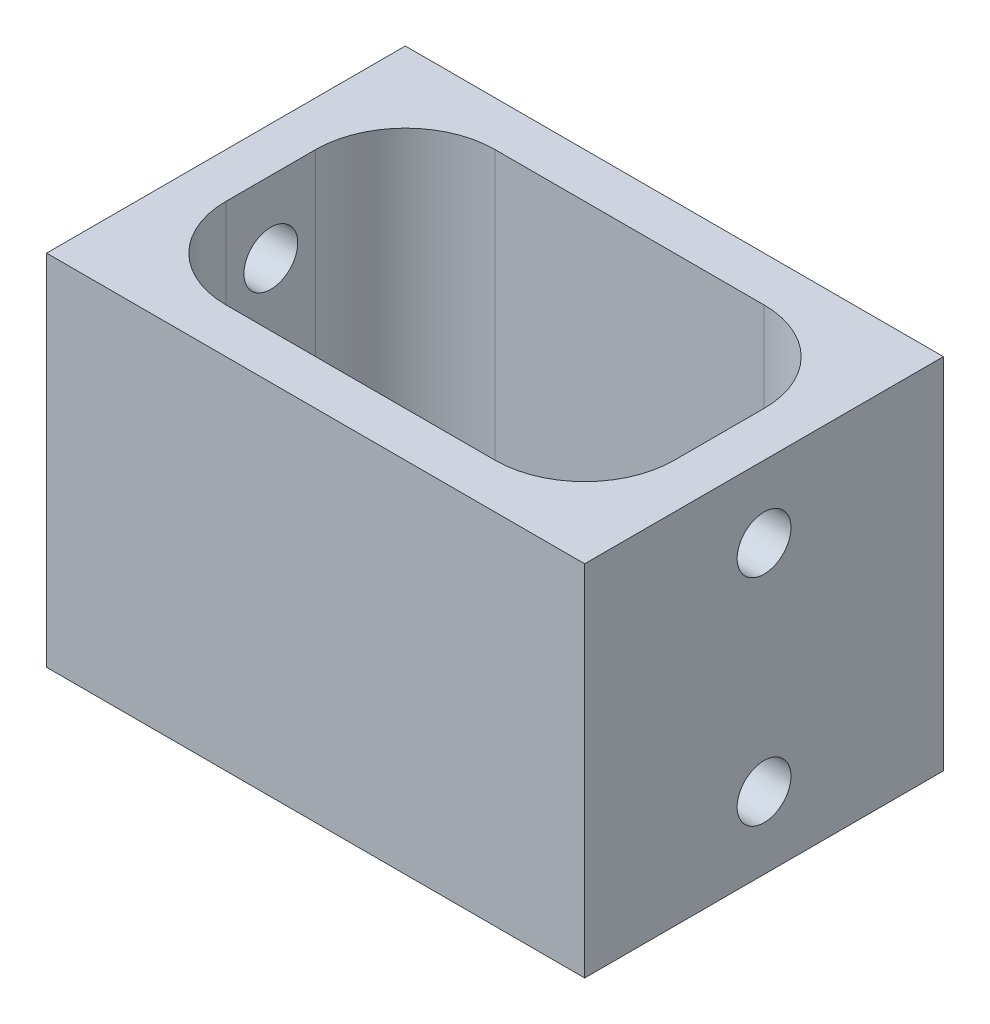
ISO-10303-21;
HEADER;
FILE_DESCRIPTION(('STEP AP214'),'2;1');
FILE_NAME('part.step','',(''),(''),'','','');
FILE_SCHEMA(('AUTOMOTIVE_DESIGN { 1 0 10303 214 1 1 1 1 }'));
ENDSEC;
DATA;
#1=APPLICATION_CONTEXT('core data for automotive mechanical design processes');
#2=APPLICATION_PROTOCOL_DEFINITION('international standard','automotive_design',2000,#1);
#3=PRODUCT_CONTEXT('',#1,'mechanical');
#4=PRODUCT('Part','Part','',(#3));
#5=PRODUCT_RELATED_PRODUCT_CATEGORY('part','',(#4));
#6=PRODUCT_DEFINITION_FORMATION('','',#4);
#7=PRODUCT_DEFINITION_CONTEXT('part definition',#1,'design');
#8=PRODUCT_DEFINITION('design','',#6,#7);
#9=PRODUCT_DEFINITION_SHAPE('','',#8);
#10=(LENGTH_UNIT() NAMED_UNIT(*) SI_UNIT(.MILLI.,.METRE.));
#11=(NAMED_UNIT(*) PLANE_ANGLE_UNIT() SI_UNIT($,.RADIAN.));
#12=(NAMED_UNIT(*) SI_UNIT($,.STERADIAN.) SOLID_ANGLE_UNIT());
#13=UNCERTAINTY_MEASURE_WITH_UNIT(LENGTH_MEASURE(1.E-05),#10,'distance_accuracy_value','');
#14=(GEOMETRIC_REPRESENTATION_CONTEXT(3) GLOBAL_UNCERTAINTY_ASSIGNED_CONTEXT((#13)) GLOBAL_UNIT_ASSIGNED_CONTEXT((#10,
#11,#12)) REPRESENTATION_CONTEXT('',''));
#15=CARTESIAN_POINT('',(0.,0.,0.));
#16=DIRECTION('',(0.,0.,1.));
#17=DIRECTION('',(1.,0.,0.));
#18=AXIS2_PLACEMENT_3D('',#15,#16,#17);
#19=CARTESIAN_POINT('',(0.,20.,0.));
#20=DIRECTION('',(0.,1.,0.));
#21=DIRECTION('',(0.,0.,1.));
#22=AXIS2_PLACEMENT_3D('',#19,#20,#21);
#23=PLANE('',#22);
#24=DIRECTION('',(0.,0.,-1.));
#25=VECTOR('',#24,1.);
#26=CARTESIAN_POINT('',(15.,20.,-10.));
#27=LINE('',#26,#25);
#28=CARTESIAN_POINT('',(15.,20.,10.));
#29=VERTEX_POINT('',#28);
#30=CARTESIAN_POINT('',(15.,20.,-10.));
#31=VERTEX_POINT('',#30);
#32=EDGE_CURVE('E136',#29,#31,#27,.T.);
#33=ORIENTED_EDGE('',*,*,#32,.T.);
#34=DIRECTION('',(-1.,0.,0.));
#35=VECTOR('',#34,1.);
#36=CARTESIAN_POINT('',(-15.,20.,-10.));
#37=LINE('',#36,#35);
#38=CARTESIAN_POINT('',(-15.,20.,-10.));
#39=VERTEX_POINT('',#38);
#40=EDGE_CURVE('E125',#31,#39,#37,.T.);
#41=ORIENTED_EDGE('',*,*,#40,.T.);
#42=DIRECTION('',(0.,0.,1.));
#43=VECTOR('',#42,1.);
#44=CARTESIAN_POINT('',(-15.,20.,-10.));
#45=LINE('',#44,#43);
#46=CARTESIAN_POINT('',(-15.,20.,10.));
#47=VERTEX_POINT('',#46);
#48=EDGE_CURVE('E135',#39,#47,#45,.T.);
#49=ORIENTED_EDGE('',*,*,#48,.T.);
#50=DIRECTION('',(1.,0.,0.));
#51=VECTOR('',#50,1.);
#52=CARTESIAN_POINT('',(-15.,20.,10.));
#53=LINE('',#52,#51);
#54=EDGE_CURVE('E140',#47,#29,#53,.T.);
#55=ORIENTED_EDGE('',*,*,#54,.T.);
#56=EDGE_LOOP('',(#33,#41,#49,#55));
#57=FACE_BOUND('',#56,.T.);
#58=DIRECTION('',(-1.,0.,0.));
#59=VECTOR('',#58,1.);
#60=CARTESIAN_POINT('',(-12.5,20.,-7.5));
#61=LINE('',#60,#59);
#62=CARTESIAN_POINT('',(7.5,20.,-7.5));
#63=VERTEX_POINT('',#62);
#64=CARTESIAN_POINT('',(-7.5,20.,-7.5));
#65=VERTEX_POINT('',#64);
#66=EDGE_CURVE('E209',#63,#65,#61,.T.);
#67=ORIENTED_EDGE('',*,*,#66,.F.);
#68=CARTESIAN_POINT('',(7.5,20.,-2.5));
#69=DIRECTION('',(0.,1.,0.));
#70=DIRECTION('',(0.,0.,1.));
#71=AXIS2_PLACEMENT_3D('',#68,#69,#70);
#72=CIRCLE('',#71,5.);
#73=CARTESIAN_POINT('',(12.5,20.,-2.5));
#74=VERTEX_POINT('',#73);
#75=EDGE_CURVE('E188',#63,#74,#72,.F.);
#76=ORIENTED_EDGE('',*,*,#75,.T.);
#77=DIRECTION('',(0.,0.,-1.));
#78=VECTOR('',#77,1.);
#79=CARTESIAN_POINT('',(12.5,20.,-7.5));
#80=LINE('',#79,#78);
#81=CARTESIAN_POINT('',(12.5,20.,2.5));
#82=VERTEX_POINT('',#81);
#83=EDGE_CURVE('E215',#82,#74,#80,.T.);
#84=ORIENTED_EDGE('',*,*,#83,.F.);
#85=CARTESIAN_POINT('',(7.5,20.,2.5));
#86=DIRECTION('',(0.,1.,0.));
#87=DIRECTION('',(0.,0.,1.));
#88=AXIS2_PLACEMENT_3D('',#85,#86,#87);
#89=CIRCLE('',#88,5.);
#90=CARTESIAN_POINT('',(7.5,20.,7.5));
#91=VERTEX_POINT('',#90);
#92=EDGE_CURVE('E184',#82,#91,#89,.F.);
#93=ORIENTED_EDGE('',*,*,#92,.T.);
#94=DIRECTION('',(1.,0.,0.));
#95=VECTOR('',#94,1.);
#96=CARTESIAN_POINT('',(-12.5,20.,7.5));
#97=LINE('',#96,#95);
#98=CARTESIAN_POINT('',(-7.5,20.,7.5));
#99=VERTEX_POINT('',#98);
#100=EDGE_CURVE('E217',#99,#91,#97,.T.);
#101=ORIENTED_EDGE('',*,*,#100,.F.);
#102=CARTESIAN_POINT('',(-7.5,20.,2.5));
#103=DIRECTION('',(0.,1.,0.));
#104=DIRECTION('',(0.,0.,1.));
#105=AXIS2_PLACEMENT_3D('',#102,#103,#104);
#106=CIRCLE('',#105,5.);
#107=CARTESIAN_POINT('',(-12.5,20.,2.5));
#108=VERTEX_POINT('',#107);
#109=EDGE_CURVE('E50',#99,#108,#106,.F.);
#110=ORIENTED_EDGE('',*,*,#109,.T.);
#111=DIRECTION('',(0.,0.,1.));
#112=VECTOR('',#111,1.);
#113=CARTESIAN_POINT('',(-12.5,20.,-7.5));
#114=LINE('',#113,#112);
#115=CARTESIAN_POINT('',(-12.5,20.,-2.5));
#116=VERTEX_POINT('',#115);
#117=EDGE_CURVE('E211',#116,#108,#114,.T.);
#118=ORIENTED_EDGE('',*,*,#117,.F.);
#119=CARTESIAN_POINT('',(-7.5,20.,-2.5));
#120=DIRECTION('',(0.,1.,0.));
#121=DIRECTION('',(0.,0.,1.));
#122=AXIS2_PLACEMENT_3D('',#119,#120,#121);
#123=CIRCLE('',#122,5.);
#124=EDGE_CURVE('E11',#116,#65,#123,.F.);
#125=ORIENTED_EDGE('',*,*,#124,.T.);
#126=EDGE_LOOP('',(#67,#76,#84,#93,#101,#110,#118,#125));
#127=FACE_BOUND('',#126,.T.);
#128=ADVANCED_FACE('F35',(#57,#127),#23,.T.);
#129=CARTESIAN_POINT('',(0.,0.,0.));
#130=DIRECTION('',(0.,1.,0.));
#131=DIRECTION('',(0.,0.,1.));
#132=AXIS2_PLACEMENT_3D('',#129,#130,#131);
#133=PLANE('',#132);
#134=DIRECTION('',(0.,0.,-1.));
#135=VECTOR('',#134,1.);
#136=CARTESIAN_POINT('',(15.,0.,-10.));
#137=LINE('',#136,#135);
#138=CARTESIAN_POINT('',(15.,0.,10.));
#139=VERTEX_POINT('',#138);
#140=CARTESIAN_POINT('',(15.,0.,-10.));
#141=VERTEX_POINT('',#140);
#142=EDGE_CURVE('E148',#139,#141,#137,.T.);
#143=ORIENTED_EDGE('',*,*,#142,.F.);
#144=DIRECTION('',(1.,0.,0.));
#145=VECTOR('',#144,1.);
#146=CARTESIAN_POINT('',(-15.,0.,10.));
#147=LINE('',#146,#145);
#148=CARTESIAN_POINT('',(-15.,0.,10.));
#149=VERTEX_POINT('',#148);
#150=EDGE_CURVE('E144',#149,#139,#147,.T.);
#151=ORIENTED_EDGE('',*,*,#150,.F.);
#152=DIRECTION('',(0.,0.,1.));
#153=VECTOR('',#152,1.);
#154=CARTESIAN_POINT('',(-15.,0.,-10.));
#155=LINE('',#154,#153);
#156=CARTESIAN_POINT('',(-15.,0.,-10.));
#157=VERTEX_POINT('',#156);
#158=EDGE_CURVE('E236',#157,#149,#155,.T.);
#159=ORIENTED_EDGE('',*,*,#158,.F.);
#160=DIRECTION('',(-1.,0.,0.));
#161=VECTOR('',#160,1.);
#162=CARTESIAN_POINT('',(-15.,0.,-10.));
#163=LINE('',#162,#161);
#164=EDGE_CURVE('E234',#141,#157,#163,.T.);
#165=ORIENTED_EDGE('',*,*,#164,.F.);
#166=EDGE_LOOP('',(#143,#151,#159,#165));
#167=FACE_BOUND('',#166,.T.);
#168=DIRECTION('',(1.,0.,0.));
#169=VECTOR('',#168,1.);
#170=CARTESIAN_POINT('',(-12.5,0.,7.5));
#171=LINE('',#170,#169);
#172=CARTESIAN_POINT('',(-7.5,0.,7.5));
#173=VERTEX_POINT('',#172);
#174=CARTESIAN_POINT('',(7.5,0.,7.5));
#175=VERTEX_POINT('',#174);
#176=EDGE_CURVE('E204',#173,#175,#171,.T.);
#177=ORIENTED_EDGE('',*,*,#176,.T.);
#178=CARTESIAN_POINT('',(7.5,0.,2.5));
#179=DIRECTION('',(0.,1.,0.));
#180=DIRECTION('',(0.,0.,1.));
#181=AXIS2_PLACEMENT_3D('',#178,#179,#180);
#182=CIRCLE('',#181,5.);
#183=CARTESIAN_POINT('',(12.5,0.,2.5));
#184=VERTEX_POINT('',#183);
#185=EDGE_CURVE('E182',#175,#184,#182,.T.);
#186=ORIENTED_EDGE('',*,*,#185,.T.);
#187=DIRECTION('',(0.,0.,-1.));
#188=VECTOR('',#187,1.);
#189=CARTESIAN_POINT('',(12.5,0.,-7.5));
#190=LINE('',#189,#188);
#191=CARTESIAN_POINT('',(12.5,0.,-2.5));
#192=VERTEX_POINT('',#191);
#193=EDGE_CURVE('E225',#184,#192,#190,.T.);
#194=ORIENTED_EDGE('',*,*,#193,.T.);
#195=CARTESIAN_POINT('',(7.5,0.,-2.5));
#196=DIRECTION('',(0.,1.,0.));
#197=DIRECTION('',(0.,0.,1.));
#198=AXIS2_PLACEMENT_3D('',#195,#196,#197);
#199=CIRCLE('',#198,5.);
#200=CARTESIAN_POINT('',(7.5,0.,-7.5));
#201=VERTEX_POINT('',#200);
#202=EDGE_CURVE('E186',#192,#201,#199,.T.);
#203=ORIENTED_EDGE('',*,*,#202,.T.);
#204=DIRECTION('',(-1.,0.,0.));
#205=VECTOR('',#204,1.);
#206=CARTESIAN_POINT('',(-12.5,0.,-7.5));
#207=LINE('',#206,#205);
#208=CARTESIAN_POINT('',(-7.5,0.,-7.5));
#209=VERTEX_POINT('',#208);
#210=EDGE_CURVE('E199',#201,#209,#207,.T.);
#211=ORIENTED_EDGE('',*,*,#210,.T.);
#212=CARTESIAN_POINT('',(-7.5,0.,-2.5));
#213=DIRECTION('',(0.,1.,0.));
#214=DIRECTION('',(0.,0.,1.));
#215=AXIS2_PLACEMENT_3D('',#212,#213,#214);
#216=CIRCLE('',#215,5.);
#217=CARTESIAN_POINT('',(-12.5,0.,-2.5));
#218=VERTEX_POINT('',#217);
#219=EDGE_CURVE('E43',#209,#218,#216,.T.);
#220=ORIENTED_EDGE('',*,*,#219,.T.);
#221=DIRECTION('',(0.,0.,1.));
#222=VECTOR('',#221,1.);
#223=CARTESIAN_POINT('',(-12.5,0.,-7.5));
#224=LINE('',#223,#222);
#225=CARTESIAN_POINT('',(-12.5,0.,2.5));
#226=VERTEX_POINT('',#225);
#227=EDGE_CURVE('E197',#218,#226,#224,.T.);
#228=ORIENTED_EDGE('',*,*,#227,.T.);
#229=CARTESIAN_POINT('',(-7.5,0.,2.5));
#230=DIRECTION('',(0.,1.,0.));
#231=DIRECTION('',(0.,0.,1.));
#232=AXIS2_PLACEMENT_3D('',#229,#230,#231);
#233=CIRCLE('',#232,5.);
#234=EDGE_CURVE('E190',#226,#173,#233,.T.);
#235=ORIENTED_EDGE('',*,*,#234,.T.);
#236=EDGE_LOOP('',(#177,#186,#194,#203,#211,#220,#228,#235));
#237=FACE_BOUND('',#236,.T.);
#238=ADVANCED_FACE('F196',(#167,#237),#133,.F.);
#239=CARTESIAN_POINT('',(15.,20.,-10.));
#240=DIRECTION('',(-1.,0.,0.));
#241=DIRECTION('',(0.,0.,1.));
#242=AXIS2_PLACEMENT_3D('',#239,#240,#241);
#243=PLANE('',#242);
#244=CARTESIAN_POINT('',(15.,16.,0.));
#245=DIRECTION('',(1.,0.,0.));
#246=DIRECTION('',(0.,0.,-1.));
#247=AXIS2_PLACEMENT_3D('',#244,#245,#246);
#248=CIRCLE('',#247,1.5);
#249=CARTESIAN_POINT('',(15.,16.,-1.5));
#250=VERTEX_POINT('',#249);
#251=EDGE_CURVE('E307',#250,#250,#248,.T.);
#252=ORIENTED_EDGE('',*,*,#251,.F.);
#253=EDGE_LOOP('',(#252));
#254=FACE_BOUND('',#253,.T.);
#255=CARTESIAN_POINT('',(15.,4.,0.));
#256=DIRECTION('',(1.,0.,0.));
#257=DIRECTION('',(0.,0.,-1.));
#258=AXIS2_PLACEMENT_3D('',#255,#256,#257);
#259=CIRCLE('',#258,1.5);
#260=CARTESIAN_POINT('',(15.,4.,-1.5));
#261=VERTEX_POINT('',#260);
#262=EDGE_CURVE('E313',#261,#261,#259,.T.);
#263=ORIENTED_EDGE('',*,*,#262,.F.);
#264=EDGE_LOOP('',(#263));
#265=FACE_BOUND('',#264,.T.);
#266=ORIENTED_EDGE('',*,*,#142,.T.);
#267=DIRECTION('',(0.,-1.,0.));
#268=VECTOR('',#267,1.);
#269=CARTESIAN_POINT('',(15.,20.,-10.));
#270=LINE('',#269,#268);
#271=EDGE_CURVE('E129',#31,#141,#270,.T.);
#272=ORIENTED_EDGE('',*,*,#271,.F.);
#273=ORIENTED_EDGE('',*,*,#32,.F.);
#274=DIRECTION('',(0.,-1.,0.));
#275=VECTOR('',#274,1.);
#276=CARTESIAN_POINT('',(15.,20.,10.));
#277=LINE('',#276,#275);
#278=EDGE_CURVE('E232',#29,#139,#277,.T.);
#279=ORIENTED_EDGE('',*,*,#278,.T.);
#280=EDGE_LOOP('',(#266,#272,#273,#279));
#281=FACE_BOUND('',#280,.T.);
#282=ADVANCED_FACE('F146',(#254,#265,#281),#243,.F.);
#283=CARTESIAN_POINT('',(-15.,20.,-10.));
#284=DIRECTION('',(0.,0.,1.));
#285=DIRECTION('',(1.,0.,0.));
#286=AXIS2_PLACEMENT_3D('',#283,#284,#285);
#287=PLANE('',#286);
#288=ORIENTED_EDGE('',*,*,#164,.T.);
#289=DIRECTION('',(0.,-1.,0.));
#290=VECTOR('',#289,1.);
#291=CARTESIAN_POINT('',(-15.,20.,-10.));
#292=LINE('',#291,#290);
#293=EDGE_CURVE('E132',#39,#157,#292,.T.);
#294=ORIENTED_EDGE('',*,*,#293,.F.);
#295=ORIENTED_EDGE('',*,*,#40,.F.);
#296=ORIENTED_EDGE('',*,*,#271,.T.);
#297=EDGE_LOOP('',(#288,#294,#295,#296));
#298=FACE_BOUND('',#297,.T.);
#299=ADVANCED_FACE('F127',(#298),#287,.F.);
#300=CARTESIAN_POINT('',(-15.,20.,-10.));
#301=DIRECTION('',(1.,0.,0.));
#302=DIRECTION('',(0.,0.,-1.));
#303=AXIS2_PLACEMENT_3D('',#300,#301,#302);
#304=PLANE('',#303);
#305=CARTESIAN_POINT('',(-15.,16.,0.));
#306=DIRECTION('',(1.,0.,0.));
#307=DIRECTION('',(0.,0.,-1.));
#308=AXIS2_PLACEMENT_3D('',#305,#306,#307);
#309=CIRCLE('',#308,1.5);
#310=CARTESIAN_POINT('',(-15.,16.,-1.5));
#311=VERTEX_POINT('',#310);
#312=EDGE_CURVE('E161',#311,#311,#309,.T.);
#313=ORIENTED_EDGE('',*,*,#312,.T.);
#314=EDGE_LOOP('',(#313));
#315=FACE_BOUND('',#314,.T.);
#316=CARTESIAN_POINT('',(-15.,4.,0.));
#317=DIRECTION('',(1.,0.,0.));
#318=DIRECTION('',(0.,0.,-1.));
#319=AXIS2_PLACEMENT_3D('',#316,#317,#318);
#320=CIRCLE('',#319,1.5);
#321=CARTESIAN_POINT('',(-15.,4.,-1.5));
#322=VERTEX_POINT('',#321);
#323=EDGE_CURVE('E309',#322,#322,#320,.T.);
#324=ORIENTED_EDGE('',*,*,#323,.T.);
#325=EDGE_LOOP('',(#324));
#326=FACE_BOUND('',#325,.T.);
#327=ORIENTED_EDGE('',*,*,#158,.T.);
#328=DIRECTION('',(0.,-1.,0.));
#329=VECTOR('',#328,1.);
#330=CARTESIAN_POINT('',(-15.,20.,10.));
#331=LINE('',#330,#329);
#332=EDGE_CURVE('E153',#47,#149,#331,.T.);
#333=ORIENTED_EDGE('',*,*,#332,.F.);
#334=ORIENTED_EDGE('',*,*,#48,.F.);
#335=ORIENTED_EDGE('',*,*,#293,.T.);
#336=EDGE_LOOP('',(#327,#333,#334,#335));
#337=FACE_BOUND('',#336,.T.);
#338=ADVANCED_FACE('F247',(#315,#326,#337),#304,.F.);
#339=CARTESIAN_POINT('',(-15.,20.,10.));
#340=DIRECTION('',(0.,0.,-1.));
#341=DIRECTION('',(-1.,0.,0.));
#342=AXIS2_PLACEMENT_3D('',#339,#340,#341);
#343=PLANE('',#342);
#344=ORIENTED_EDGE('',*,*,#150,.T.);
#345=ORIENTED_EDGE('',*,*,#278,.F.);
#346=ORIENTED_EDGE('',*,*,#54,.F.);
#347=ORIENTED_EDGE('',*,*,#332,.T.);
#348=EDGE_LOOP('',(#344,#345,#346,#347));
#349=FACE_BOUND('',#348,.T.);
#350=ADVANCED_FACE('F243',(#349),#343,.F.);
#351=CARTESIAN_POINT('',(12.5,20.,-7.5));
#352=DIRECTION('',(-1.,0.,0.));
#353=DIRECTION('',(0.,0.,1.));
#354=AXIS2_PLACEMENT_3D('',#351,#352,#353);
#355=PLANE('',#354);
#356=CARTESIAN_POINT('',(12.5,16.,0.));
#357=DIRECTION('',(-1.,0.,0.));
#358=DIRECTION('',(0.,0.,1.));
#359=AXIS2_PLACEMENT_3D('',#356,#357,#358);
#360=CIRCLE('',#359,1.5);
#361=CARTESIAN_POINT('',(12.5,16.,1.5));
#362=VERTEX_POINT('',#361);
#363=EDGE_CURVE('E164',#362,#362,#360,.T.);
#364=ORIENTED_EDGE('',*,*,#363,.F.);
#365=EDGE_LOOP('',(#364));
#366=FACE_BOUND('',#365,.T.);
#367=CARTESIAN_POINT('',(12.5,4.,0.));
#368=DIRECTION('',(-1.,0.,0.));
#369=DIRECTION('',(0.,0.,1.));
#370=AXIS2_PLACEMENT_3D('',#367,#368,#369);
#371=CIRCLE('',#370,1.5);
#372=CARTESIAN_POINT('',(12.5,4.,1.5));
#373=VERTEX_POINT('',#372);
#374=EDGE_CURVE('E160',#373,#373,#371,.T.);
#375=ORIENTED_EDGE('',*,*,#374,.F.);
#376=EDGE_LOOP('',(#375));
#377=FACE_BOUND('',#376,.T.);
#378=ORIENTED_EDGE('',*,*,#193,.F.);
#379=DIRECTION('',(0.,-1.,0.));
#380=VECTOR('',#379,1.);
#381=CARTESIAN_POINT('',(12.5,20.,2.5));
#382=LINE('',#381,#380);
#383=EDGE_CURVE('E171',#184,#82,#382,.F.);
#384=ORIENTED_EDGE('',*,*,#383,.T.);
#385=ORIENTED_EDGE('',*,*,#83,.T.);
#386=DIRECTION('',(0.,-1.,0.));
#387=VECTOR('',#386,1.);
#388=CARTESIAN_POINT('',(12.5,0.,-2.5));
#389=LINE('',#388,#387);
#390=EDGE_CURVE('E168',#74,#192,#389,.T.);
#391=ORIENTED_EDGE('',*,*,#390,.T.);
#392=EDGE_LOOP('',(#378,#384,#385,#391));
#393=FACE_BOUND('',#392,.T.);
#394=ADVANCED_FACE('F255',(#366,#377,#393),#355,.T.);
#395=CARTESIAN_POINT('',(-12.5,20.,-7.5));
#396=DIRECTION('',(0.,0.,1.));
#397=DIRECTION('',(1.,0.,0.));
#398=AXIS2_PLACEMENT_3D('',#395,#396,#397);
#399=PLANE('',#398);
#400=ORIENTED_EDGE('',*,*,#210,.F.);
#401=DIRECTION('',(0.,-1.,0.));
#402=VECTOR('',#401,1.);
#403=CARTESIAN_POINT('',(7.5,20.,-7.5));
#404=LINE('',#403,#402);
#405=EDGE_CURVE('E176',#201,#63,#404,.F.);
#406=ORIENTED_EDGE('',*,*,#405,.T.);
#407=ORIENTED_EDGE('',*,*,#66,.T.);
#408=DIRECTION('',(0.,-1.,0.));
#409=VECTOR('',#408,1.);
#410=CARTESIAN_POINT('',(-7.5,0.,-7.5));
#411=LINE('',#410,#409);
#412=EDGE_CURVE('E173',#65,#209,#411,.T.);
#413=ORIENTED_EDGE('',*,*,#412,.T.);
#414=EDGE_LOOP('',(#400,#406,#407,#413));
#415=FACE_BOUND('',#414,.T.);
#416=ADVANCED_FACE('F213',(#415),#399,.T.);
#417=CARTESIAN_POINT('',(-12.5,20.,-7.5));
#418=DIRECTION('',(1.,0.,0.));
#419=DIRECTION('',(0.,0.,-1.));
#420=AXIS2_PLACEMENT_3D('',#417,#418,#419);
#421=PLANE('',#420);
#422=CARTESIAN_POINT('',(-12.5,16.,0.));
#423=DIRECTION('',(1.,0.,0.));
#424=DIRECTION('',(0.,0.,-1.));
#425=AXIS2_PLACEMENT_3D('',#422,#423,#424);
#426=CIRCLE('',#425,1.5);
#427=CARTESIAN_POINT('',(-12.5,16.,-1.5));
#428=VERTEX_POINT('',#427);
#429=EDGE_CURVE('E162',#428,#428,#426,.T.);
#430=ORIENTED_EDGE('',*,*,#429,.F.);
#431=EDGE_LOOP('',(#430));
#432=FACE_BOUND('',#431,.T.);
#433=CARTESIAN_POINT('',(-12.5,4.,0.));
#434=DIRECTION('',(1.,0.,0.));
#435=DIRECTION('',(0.,0.,-1.));
#436=AXIS2_PLACEMENT_3D('',#433,#434,#435);
#437=CIRCLE('',#436,1.5);
#438=CARTESIAN_POINT('',(-12.5,4.,-1.5));
#439=VERTEX_POINT('',#438);
#440=EDGE_CURVE('E157',#439,#439,#437,.T.);
#441=ORIENTED_EDGE('',*,*,#440,.F.);
#442=EDGE_LOOP('',(#441));
#443=FACE_BOUND('',#442,.T.);
#444=ORIENTED_EDGE('',*,*,#117,.T.);
#445=DIRECTION('',(0.,-1.,0.));
#446=VECTOR('',#445,1.);
#447=CARTESIAN_POINT('',(-12.5,0.,2.5));
#448=LINE('',#447,#446);
#449=EDGE_CURVE('E179',#108,#226,#448,.T.);
#450=ORIENTED_EDGE('',*,*,#449,.T.);
#451=ORIENTED_EDGE('',*,*,#227,.F.);
#452=DIRECTION('',(0.,-1.,0.));
#453=VECTOR('',#452,1.);
#454=CARTESIAN_POINT('',(-12.5,20.,-2.5));
#455=LINE('',#454,#453);
#456=EDGE_CURVE('E57',#218,#116,#455,.F.);
#457=ORIENTED_EDGE('',*,*,#456,.T.);
#458=EDGE_LOOP('',(#444,#450,#451,#457));
#459=FACE_BOUND('',#458,.T.);
#460=ADVANCED_FACE('F202',(#432,#443,#459),#421,.T.);
#461=CARTESIAN_POINT('',(-12.5,20.,7.5));
#462=DIRECTION('',(0.,0.,-1.));
#463=DIRECTION('',(-1.,0.,0.));
#464=AXIS2_PLACEMENT_3D('',#461,#462,#463);
#465=PLANE('',#464);
#466=ORIENTED_EDGE('',*,*,#100,.T.);
#467=DIRECTION('',(0.,-1.,0.));
#468=VECTOR('',#467,1.);
#469=CARTESIAN_POINT('',(7.5,0.,7.5));
#470=LINE('',#469,#468);
#471=EDGE_CURVE('E151',#91,#175,#470,.T.);
#472=ORIENTED_EDGE('',*,*,#471,.T.);
#473=ORIENTED_EDGE('',*,*,#176,.F.);
#474=DIRECTION('',(0.,-1.,0.));
#475=VECTOR('',#474,1.);
#476=CARTESIAN_POINT('',(-7.5,20.,7.5));
#477=LINE('',#476,#475);
#478=EDGE_CURVE('E149',#173,#99,#477,.F.);
#479=ORIENTED_EDGE('',*,*,#478,.T.);
#480=EDGE_LOOP('',(#466,#472,#473,#479));
#481=FACE_BOUND('',#480,.T.);
#482=ADVANCED_FACE('F275',(#481),#465,.T.);
#483=CARTESIAN_POINT('',(-15.,4.,0.));
#484=DIRECTION('',(1.,0.,0.));
#485=DIRECTION('',(0.,0.,-1.));
#486=AXIS2_PLACEMENT_3D('',#483,#484,#485);
#487=CYLINDRICAL_SURFACE('',#486,1.5);
#488=ORIENTED_EDGE('',*,*,#440,.T.);
#489=EDGE_LOOP('',(#488));
#490=FACE_BOUND('',#489,.T.);
#491=ORIENTED_EDGE('',*,*,#323,.F.);
#492=EDGE_LOOP('',(#491));
#493=FACE_BOUND('',#492,.T.);
#494=ADVANCED_FACE('F279',(#490,#493),#487,.F.);
#495=CARTESIAN_POINT('',(-15.,16.,0.));
#496=DIRECTION('',(1.,0.,0.));
#497=DIRECTION('',(0.,0.,-1.));
#498=AXIS2_PLACEMENT_3D('',#495,#496,#497);
#499=CYLINDRICAL_SURFACE('',#498,1.5);
#500=ORIENTED_EDGE('',*,*,#429,.T.);
#501=EDGE_LOOP('',(#500));
#502=FACE_BOUND('',#501,.T.);
#503=ORIENTED_EDGE('',*,*,#312,.F.);
#504=EDGE_LOOP('',(#503));
#505=FACE_BOUND('',#504,.T.);
#506=ADVANCED_FACE('F283',(#502,#505),#499,.F.);
#507=ORIENTED_EDGE('',*,*,#374,.T.);
#508=EDGE_LOOP('',(#507));
#509=FACE_BOUND('',#508,.T.);
#510=ORIENTED_EDGE('',*,*,#262,.T.);
#511=EDGE_LOOP('',(#510));
#512=FACE_BOUND('',#511,.T.);
#513=ADVANCED_FACE('F285',(#509,#512),#487,.F.);
#514=ORIENTED_EDGE('',*,*,#363,.T.);
#515=EDGE_LOOP('',(#514));
#516=FACE_BOUND('',#515,.T.);
#517=ORIENTED_EDGE('',*,*,#251,.T.);
#518=EDGE_LOOP('',(#517));
#519=FACE_BOUND('',#518,.T.);
#520=ADVANCED_FACE('F288',(#516,#519),#499,.F.);
#521=CARTESIAN_POINT('',(7.5,20.,2.5));
#522=DIRECTION('',(0.,1.,0.));
#523=DIRECTION('',(0.,0.,1.));
#524=AXIS2_PLACEMENT_3D('',#521,#522,#523);
#525=CYLINDRICAL_SURFACE('',#524,5.);
#526=ORIENTED_EDGE('',*,*,#92,.F.);
#527=ORIENTED_EDGE('',*,*,#383,.F.);
#528=ORIENTED_EDGE('',*,*,#185,.F.);
#529=ORIENTED_EDGE('',*,*,#471,.F.);
#530=EDGE_LOOP('',(#526,#527,#528,#529));
#531=FACE_BOUND('',#530,.T.);
#532=ADVANCED_FACE('F295',(#531),#525,.F.);
#533=CARTESIAN_POINT('',(7.5,20.,-2.5));
#534=DIRECTION('',(0.,1.,0.));
#535=DIRECTION('',(0.,0.,1.));
#536=AXIS2_PLACEMENT_3D('',#533,#534,#535);
#537=CYLINDRICAL_SURFACE('',#536,5.);
#538=ORIENTED_EDGE('',*,*,#75,.F.);
#539=ORIENTED_EDGE('',*,*,#405,.F.);
#540=ORIENTED_EDGE('',*,*,#202,.F.);
#541=ORIENTED_EDGE('',*,*,#390,.F.);
#542=EDGE_LOOP('',(#538,#539,#540,#541));
#543=FACE_BOUND('',#542,.T.);
#544=ADVANCED_FACE('F299',(#543),#537,.F.);
#545=CARTESIAN_POINT('',(-7.5,20.,2.5));
#546=DIRECTION('',(0.,1.,0.));
#547=DIRECTION('',(0.,0.,1.));
#548=AXIS2_PLACEMENT_3D('',#545,#546,#547);
#549=CYLINDRICAL_SURFACE('',#548,5.);
#550=ORIENTED_EDGE('',*,*,#109,.F.);
#551=ORIENTED_EDGE('',*,*,#478,.F.);
#552=ORIENTED_EDGE('',*,*,#234,.F.);
#553=ORIENTED_EDGE('',*,*,#449,.F.);
#554=EDGE_LOOP('',(#550,#551,#552,#553));
#555=FACE_BOUND('',#554,.T.);
#556=ADVANCED_FACE('F332',(#555),#549,.F.);
#557=CARTESIAN_POINT('',(-7.5,20.,-2.5));
#558=DIRECTION('',(0.,1.,0.));
#559=DIRECTION('',(0.,0.,1.));
#560=AXIS2_PLACEMENT_3D('',#557,#558,#559);
#561=CYLINDRICAL_SURFACE('',#560,5.);
#562=ORIENTED_EDGE('',*,*,#124,.F.);
#563=ORIENTED_EDGE('',*,*,#456,.F.);
#564=ORIENTED_EDGE('',*,*,#219,.F.);
#565=ORIENTED_EDGE('',*,*,#412,.F.);
#566=EDGE_LOOP('',(#562,#563,#564,#565));
#567=FACE_BOUND('',#566,.T.);
#568=ADVANCED_FACE('F37',(#567),#561,.F.);
#569=CLOSED_SHELL('',(#128,#238,#282,#299,#338,#350,#394,#416,#460,#482,#494,#506,#513,#520,
#532,#544,#556,#568));
#570=MANIFOLD_SOLID_BREP('B2',#569);
#571=ADVANCED_BREP_SHAPE_REPRESENTATION('',(#18,#570),#14);
#572=SHAPE_DEFINITION_REPRESENTATION(#9,#571);
ENDSEC;
END-ISO-10303-21;
